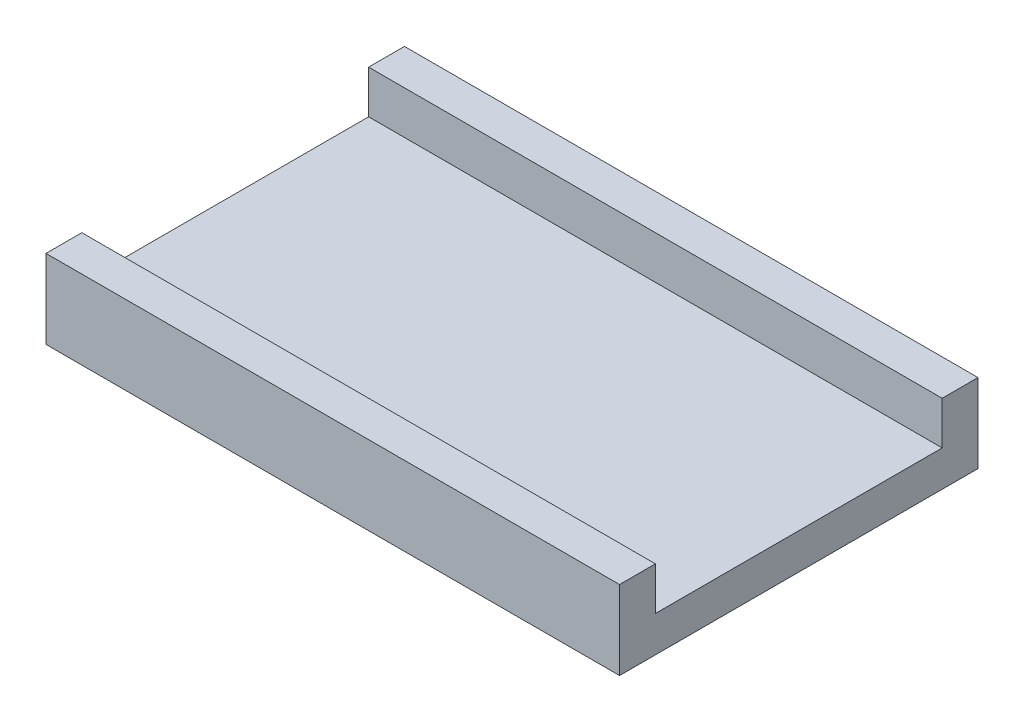
ISO-10303-21;
HEADER;
FILE_DESCRIPTION(('STEP AP214'),'2;1');
FILE_NAME('part.step','',(''),(''),'','','');
FILE_SCHEMA(('AUTOMOTIVE_DESIGN { 1 0 10303 214 1 1 1 1 }'));
ENDSEC;
DATA;
#1=APPLICATION_CONTEXT('core data for automotive mechanical design processes');
#2=APPLICATION_PROTOCOL_DEFINITION('international standard','automotive_design',2000,#1);
#3=PRODUCT_CONTEXT('',#1,'mechanical');
#4=PRODUCT('Part','Part','',(#3));
#5=PRODUCT_RELATED_PRODUCT_CATEGORY('part','',(#4));
#6=PRODUCT_DEFINITION_FORMATION('','',#4);
#7=PRODUCT_DEFINITION_CONTEXT('part definition',#1,'design');
#8=PRODUCT_DEFINITION('design','',#6,#7);
#9=PRODUCT_DEFINITION_SHAPE('','',#8);
#10=(LENGTH_UNIT() NAMED_UNIT(*) SI_UNIT(.MILLI.,.METRE.));
#11=(NAMED_UNIT(*) PLANE_ANGLE_UNIT() SI_UNIT($,.RADIAN.));
#12=(NAMED_UNIT(*) SI_UNIT($,.STERADIAN.) SOLID_ANGLE_UNIT());
#13=UNCERTAINTY_MEASURE_WITH_UNIT(LENGTH_MEASURE(1.E-05),#10,'distance_accuracy_value','');
#14=(GEOMETRIC_REPRESENTATION_CONTEXT(3) GLOBAL_UNCERTAINTY_ASSIGNED_CONTEXT((#13)) GLOBAL_UNIT_ASSIGNED_CONTEXT((#10,
#11,#12)) REPRESENTATION_CONTEXT('',''));
#15=CARTESIAN_POINT('',(0.,0.,0.));
#16=DIRECTION('',(0.,0.,1.));
#17=DIRECTION('',(1.,0.,0.));
#18=AXIS2_PLACEMENT_3D('',#15,#16,#17);
#19=CARTESIAN_POINT('',(0.,5.,0.));
#20=DIRECTION('',(0.,1.,0.));
#21=DIRECTION('',(0.,0.,1.));
#22=AXIS2_PLACEMENT_3D('',#19,#20,#21);
#23=PLANE('',#22);
#24=DIRECTION('',(0.,0.,1.));
#25=VECTOR('',#24,1.);
#26=CARTESIAN_POINT('',(0.,5.,0.));
#27=LINE('',#26,#25);
#28=CARTESIAN_POINT('',(0.,5.,-45.));
#29=VERTEX_POINT('',#28);
#30=CARTESIAN_POINT('',(0.,5.,-4.99999999999999));
#31=VERTEX_POINT('',#30);
#32=EDGE_CURVE('E53',#29,#31,#27,.T.);
#33=ORIENTED_EDGE('',*,*,#32,.T.);
#34=DIRECTION('',(-1.,0.,0.));
#35=VECTOR('',#34,1.);
#36=CARTESIAN_POINT('',(80.,5.,-5.));
#37=LINE('',#36,#35);
#38=CARTESIAN_POINT('',(80.,5.,-5.));
#39=VERTEX_POINT('',#38);
#40=EDGE_CURVE('E48',#39,#31,#37,.T.);
#41=ORIENTED_EDGE('',*,*,#40,.F.);
#42=DIRECTION('',(0.,0.,1.));
#43=VECTOR('',#42,1.);
#44=CARTESIAN_POINT('',(80.,5.,0.));
#45=LINE('',#44,#43);
#46=CARTESIAN_POINT('',(80.,5.,-45.));
#47=VERTEX_POINT('',#46);
#48=EDGE_CURVE('E119',#47,#39,#45,.T.);
#49=ORIENTED_EDGE('',*,*,#48,.F.);
#50=DIRECTION('',(1.,0.,0.));
#51=VECTOR('',#50,1.);
#52=CARTESIAN_POINT('',(0.,5.,-45.));
#53=LINE('',#52,#51);
#54=EDGE_CURVE('E120',#29,#47,#53,.T.);
#55=ORIENTED_EDGE('',*,*,#54,.F.);
#56=EDGE_LOOP('',(#33,#41,#49,#55));
#57=FACE_BOUND('',#56,.T.);
#58=ADVANCED_FACE('F33',(#57),#23,.T.);
#59=CARTESIAN_POINT('',(0.,5.,0.));
#60=DIRECTION('',(1.,0.,0.));
#61=DIRECTION('',(0.,0.,-1.));
#62=AXIS2_PLACEMENT_3D('',#59,#60,#61);
#63=PLANE('',#62);
#64=DIRECTION('',(0.,0.,1.));
#65=VECTOR('',#64,1.);
#66=CARTESIAN_POINT('',(0.,0.,0.));
#67=LINE('',#66,#65);
#68=CARTESIAN_POINT('',(0.,0.,-50.));
#69=VERTEX_POINT('',#68);
#70=CARTESIAN_POINT('',(0.,0.,0.));
#71=VERTEX_POINT('',#70);
#72=EDGE_CURVE('E143',#69,#71,#67,.T.);
#73=ORIENTED_EDGE('',*,*,#72,.T.);
#74=DIRECTION('',(0.,-1.,0.));
#75=VECTOR('',#74,1.);
#76=CARTESIAN_POINT('',(0.,5.,0.));
#77=LINE('',#76,#75);
#78=CARTESIAN_POINT('',(0.,11.,0.));
#79=VERTEX_POINT('',#78);
#80=EDGE_CURVE('E11',#79,#71,#77,.T.);
#81=ORIENTED_EDGE('',*,*,#80,.F.);
#82=DIRECTION('',(0.,0.,1.));
#83=VECTOR('',#82,1.);
#84=CARTESIAN_POINT('',(0.,11.,0.));
#85=LINE('',#84,#83);
#86=CARTESIAN_POINT('',(0.,11.,-4.99999999999999));
#87=VERTEX_POINT('',#86);
#88=EDGE_CURVE('E106',#87,#79,#85,.T.);
#89=ORIENTED_EDGE('',*,*,#88,.F.);
#90=DIRECTION('',(0.,-1.,0.));
#91=VECTOR('',#90,1.);
#92=CARTESIAN_POINT('',(0.,11.,-4.99999999999999));
#93=LINE('',#92,#91);
#94=EDGE_CURVE('E102',#87,#31,#93,.T.);
#95=ORIENTED_EDGE('',*,*,#94,.T.);
#96=ORIENTED_EDGE('',*,*,#32,.F.);
#97=DIRECTION('',(0.,-1.,0.));
#98=VECTOR('',#97,1.);
#99=CARTESIAN_POINT('',(0.,11.,-45.));
#100=LINE('',#99,#98);
#101=CARTESIAN_POINT('',(0.,11.,-45.));
#102=VERTEX_POINT('',#101);
#103=EDGE_CURVE('E140',#102,#29,#100,.T.);
#104=ORIENTED_EDGE('',*,*,#103,.F.);
#105=DIRECTION('',(0.,0.,1.));
#106=VECTOR('',#105,1.);
#107=CARTESIAN_POINT('',(0.,11.,-50.));
#108=LINE('',#107,#106);
#109=CARTESIAN_POINT('',(0.,11.,-50.));
#110=VERTEX_POINT('',#109);
#111=EDGE_CURVE('E123',#110,#102,#108,.T.);
#112=ORIENTED_EDGE('',*,*,#111,.F.);
#113=DIRECTION('',(0.,-1.,0.));
#114=VECTOR('',#113,1.);
#115=CARTESIAN_POINT('',(0.,5.,-50.));
#116=LINE('',#115,#114);
#117=EDGE_CURVE('E147',#110,#69,#116,.T.);
#118=ORIENTED_EDGE('',*,*,#117,.T.);
#119=EDGE_LOOP('',(#73,#81,#89,#95,#96,#104,#112,#118));
#120=FACE_BOUND('',#119,.T.);
#121=ADVANCED_FACE('F35',(#120),#63,.F.);
#122=CARTESIAN_POINT('',(0.,5.,0.));
#123=DIRECTION('',(0.,0.,-1.));
#124=DIRECTION('',(-1.,0.,0.));
#125=AXIS2_PLACEMENT_3D('',#122,#123,#124);
#126=PLANE('',#125);
#127=DIRECTION('',(1.,0.,0.));
#128=VECTOR('',#127,1.);
#129=CARTESIAN_POINT('',(0.,0.,0.));
#130=LINE('',#129,#128);
#131=CARTESIAN_POINT('',(80.,0.,0.));
#132=VERTEX_POINT('',#131);
#133=EDGE_CURVE('E150',#71,#132,#130,.T.);
#134=ORIENTED_EDGE('',*,*,#133,.T.);
#135=DIRECTION('',(0.,-1.,0.));
#136=VECTOR('',#135,1.);
#137=CARTESIAN_POINT('',(80.,5.,0.));
#138=LINE('',#137,#136);
#139=CARTESIAN_POINT('',(80.,11.,0.));
#140=VERTEX_POINT('',#139);
#141=EDGE_CURVE('E41',#140,#132,#138,.T.);
#142=ORIENTED_EDGE('',*,*,#141,.F.);
#143=DIRECTION('',(1.,0.,0.));
#144=VECTOR('',#143,1.);
#145=CARTESIAN_POINT('',(80.,11.,0.));
#146=LINE('',#145,#144);
#147=EDGE_CURVE('E113',#79,#140,#146,.T.);
#148=ORIENTED_EDGE('',*,*,#147,.F.);
#149=ORIENTED_EDGE('',*,*,#80,.T.);
#150=EDGE_LOOP('',(#134,#142,#148,#149));
#151=FACE_BOUND('',#150,.T.);
#152=ADVANCED_FACE('F161',(#151),#126,.F.);
#153=CARTESIAN_POINT('',(80.,5.,0.));
#154=DIRECTION('',(1.,0.,0.));
#155=DIRECTION('',(0.,0.,-1.));
#156=AXIS2_PLACEMENT_3D('',#153,#154,#155);
#157=PLANE('',#156);
#158=DIRECTION('',(0.,0.,1.));
#159=VECTOR('',#158,1.);
#160=CARTESIAN_POINT('',(80.,0.,0.));
#161=LINE('',#160,#159);
#162=CARTESIAN_POINT('',(80.,0.,-50.));
#163=VERTEX_POINT('',#162);
#164=EDGE_CURVE('E153',#163,#132,#161,.T.);
#165=ORIENTED_EDGE('',*,*,#164,.F.);
#166=DIRECTION('',(0.,-1.,0.));
#167=VECTOR('',#166,1.);
#168=CARTESIAN_POINT('',(80.,5.,-50.));
#169=LINE('',#168,#167);
#170=CARTESIAN_POINT('',(80.,11.,-50.));
#171=VERTEX_POINT('',#170);
#172=EDGE_CURVE('E159',#171,#163,#169,.T.);
#173=ORIENTED_EDGE('',*,*,#172,.F.);
#174=DIRECTION('',(0.,0.,-1.));
#175=VECTOR('',#174,1.);
#176=CARTESIAN_POINT('',(80.,11.,-50.));
#177=LINE('',#176,#175);
#178=CARTESIAN_POINT('',(80.,11.,-45.));
#179=VERTEX_POINT('',#178);
#180=EDGE_CURVE('E132',#179,#171,#177,.T.);
#181=ORIENTED_EDGE('',*,*,#180,.F.);
#182=DIRECTION('',(0.,-1.,0.));
#183=VECTOR('',#182,1.);
#184=CARTESIAN_POINT('',(80.,11.,-45.));
#185=LINE('',#184,#183);
#186=EDGE_CURVE('E137',#179,#47,#185,.T.);
#187=ORIENTED_EDGE('',*,*,#186,.T.);
#188=ORIENTED_EDGE('',*,*,#48,.T.);
#189=DIRECTION('',(0.,-1.,0.));
#190=VECTOR('',#189,1.);
#191=CARTESIAN_POINT('',(80.,11.,-5.));
#192=LINE('',#191,#190);
#193=CARTESIAN_POINT('',(80.,11.,-5.));
#194=VERTEX_POINT('',#193);
#195=EDGE_CURVE('E100',#194,#39,#192,.T.);
#196=ORIENTED_EDGE('',*,*,#195,.F.);
#197=DIRECTION('',(0.,0.,-1.));
#198=VECTOR('',#197,1.);
#199=CARTESIAN_POINT('',(80.,11.,0.));
#200=LINE('',#199,#198);
#201=EDGE_CURVE('E107',#140,#194,#200,.T.);
#202=ORIENTED_EDGE('',*,*,#201,.F.);
#203=ORIENTED_EDGE('',*,*,#141,.T.);
#204=EDGE_LOOP('',(#165,#173,#181,#187,#188,#196,#202,#203));
#205=FACE_BOUND('',#204,.T.);
#206=ADVANCED_FACE('F117',(#205),#157,.T.);
#207=CARTESIAN_POINT('',(0.,5.,-50.));
#208=DIRECTION('',(0.,0.,-1.));
#209=DIRECTION('',(-1.,0.,0.));
#210=AXIS2_PLACEMENT_3D('',#207,#208,#209);
#211=PLANE('',#210);
#212=DIRECTION('',(1.,0.,0.));
#213=VECTOR('',#212,1.);
#214=CARTESIAN_POINT('',(0.,0.,-50.));
#215=LINE('',#214,#213);
#216=EDGE_CURVE('E145',#69,#163,#215,.T.);
#217=ORIENTED_EDGE('',*,*,#216,.F.);
#218=ORIENTED_EDGE('',*,*,#117,.F.);
#219=DIRECTION('',(-1.,0.,0.));
#220=VECTOR('',#219,1.);
#221=CARTESIAN_POINT('',(0.,11.,-50.));
#222=LINE('',#221,#220);
#223=EDGE_CURVE('E135',#171,#110,#222,.T.);
#224=ORIENTED_EDGE('',*,*,#223,.F.);
#225=ORIENTED_EDGE('',*,*,#172,.T.);
#226=EDGE_LOOP('',(#217,#218,#224,#225));
#227=FACE_BOUND('',#226,.T.);
#228=ADVANCED_FACE('F167',(#227),#211,.T.);
#229=CARTESIAN_POINT('',(0.,0.,0.));
#230=DIRECTION('',(0.,1.,0.));
#231=DIRECTION('',(0.,0.,1.));
#232=AXIS2_PLACEMENT_3D('',#229,#230,#231);
#233=PLANE('',#232);
#234=ORIENTED_EDGE('',*,*,#72,.F.);
#235=ORIENTED_EDGE('',*,*,#216,.T.);
#236=ORIENTED_EDGE('',*,*,#164,.T.);
#237=ORIENTED_EDGE('',*,*,#133,.F.);
#238=EDGE_LOOP('',(#234,#235,#236,#237));
#239=FACE_BOUND('',#238,.T.);
#240=ADVANCED_FACE('F164',(#239),#233,.F.);
#241=CARTESIAN_POINT('',(0.,11.,-45.));
#242=DIRECTION('',(0.,0.,-1.));
#243=DIRECTION('',(-1.,0.,0.));
#244=AXIS2_PLACEMENT_3D('',#241,#242,#243);
#245=PLANE('',#244);
#246=ORIENTED_EDGE('',*,*,#54,.T.);
#247=ORIENTED_EDGE('',*,*,#186,.F.);
#248=DIRECTION('',(1.,0.,0.));
#249=VECTOR('',#248,1.);
#250=CARTESIAN_POINT('',(0.,11.,-45.));
#251=LINE('',#250,#249);
#252=EDGE_CURVE('E130',#102,#179,#251,.T.);
#253=ORIENTED_EDGE('',*,*,#252,.F.);
#254=ORIENTED_EDGE('',*,*,#103,.T.);
#255=EDGE_LOOP('',(#246,#247,#253,#254));
#256=FACE_BOUND('',#255,.T.);
#257=ADVANCED_FACE('F176',(#256),#245,.F.);
#258=CARTESIAN_POINT('',(0.,11.,0.));
#259=DIRECTION('',(0.,1.,0.));
#260=DIRECTION('',(0.,0.,1.));
#261=AXIS2_PLACEMENT_3D('',#258,#259,#260);
#262=PLANE('',#261);
#263=ORIENTED_EDGE('',*,*,#111,.T.);
#264=ORIENTED_EDGE('',*,*,#252,.T.);
#265=ORIENTED_EDGE('',*,*,#180,.T.);
#266=ORIENTED_EDGE('',*,*,#223,.T.);
#267=EDGE_LOOP('',(#263,#264,#265,#266));
#268=FACE_BOUND('',#267,.T.);
#269=ADVANCED_FACE('F171',(#268),#262,.T.);
#270=CARTESIAN_POINT('',(80.,11.,-5.));
#271=DIRECTION('',(0.,0.,1.));
#272=DIRECTION('',(1.,0.,0.));
#273=AXIS2_PLACEMENT_3D('',#270,#271,#272);
#274=PLANE('',#273);
#275=ORIENTED_EDGE('',*,*,#40,.T.);
#276=ORIENTED_EDGE('',*,*,#94,.F.);
#277=DIRECTION('',(-1.,0.,0.));
#278=VECTOR('',#277,1.);
#279=CARTESIAN_POINT('',(80.,11.,-5.));
#280=LINE('',#279,#278);
#281=EDGE_CURVE('E96',#194,#87,#280,.T.);
#282=ORIENTED_EDGE('',*,*,#281,.F.);
#283=ORIENTED_EDGE('',*,*,#195,.T.);
#284=EDGE_LOOP('',(#275,#276,#282,#283));
#285=FACE_BOUND('',#284,.T.);
#286=ADVANCED_FACE('F98',(#285),#274,.F.);
#287=CARTESIAN_POINT('',(0.,11.,0.));
#288=DIRECTION('',(0.,1.,0.));
#289=DIRECTION('',(0.,0.,1.));
#290=AXIS2_PLACEMENT_3D('',#287,#288,#289);
#291=PLANE('',#290);
#292=ORIENTED_EDGE('',*,*,#201,.T.);
#293=ORIENTED_EDGE('',*,*,#281,.T.);
#294=ORIENTED_EDGE('',*,*,#88,.T.);
#295=ORIENTED_EDGE('',*,*,#147,.T.);
#296=EDGE_LOOP('',(#292,#293,#294,#295));
#297=FACE_BOUND('',#296,.T.);
#298=ADVANCED_FACE('F111',(#297),#291,.T.);
#299=CLOSED_SHELL('',(#58,#121,#152,#206,#228,#240,#257,#269,#286,#298));
#300=MANIFOLD_SOLID_BREP('B2',#299);
#301=ADVANCED_BREP_SHAPE_REPRESENTATION('',(#18,#300),#14);
#302=SHAPE_DEFINITION_REPRESENTATION(#9,#301);
ENDSEC;
END-ISO-10303-21;
